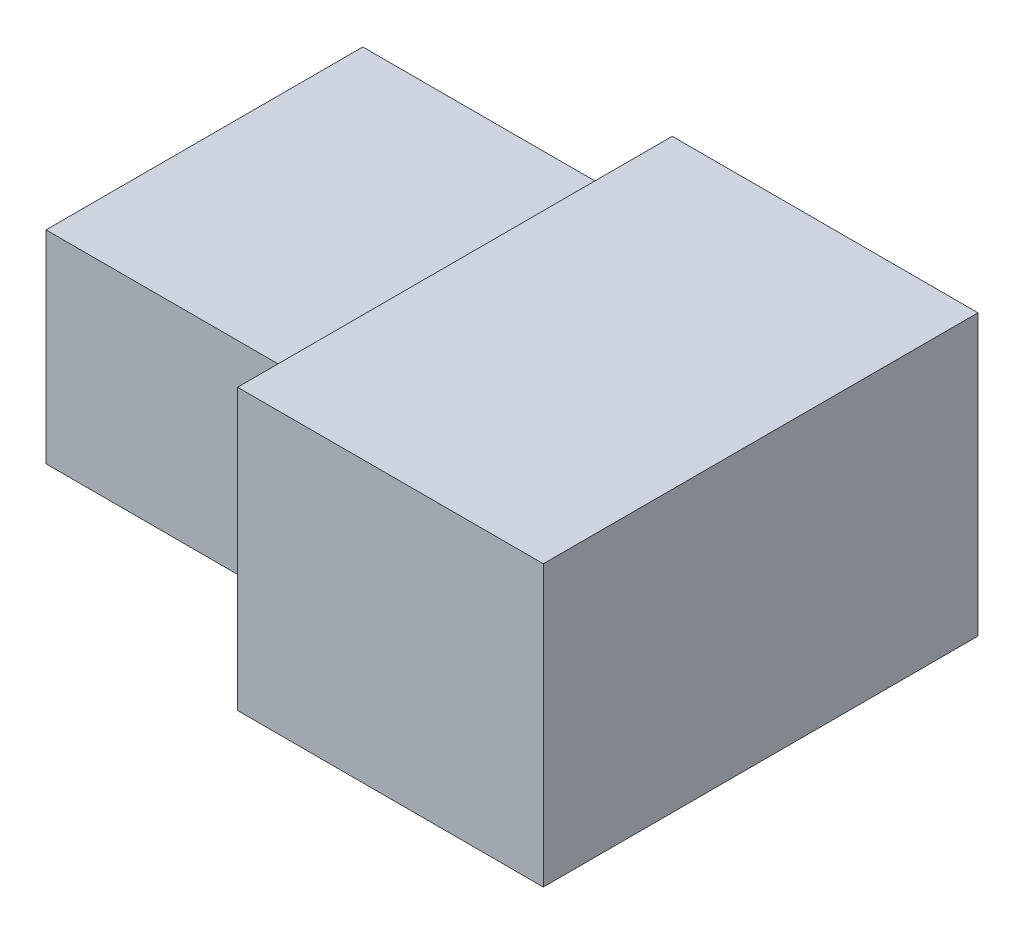
ISO-10303-21;
HEADER;
FILE_DESCRIPTION(('STEP AP214'),'2;1');
FILE_NAME('part.step','',(''),(''),'','','');
FILE_SCHEMA(('AUTOMOTIVE_DESIGN { 1 0 10303 214 1 1 1 1 }'));
ENDSEC;
DATA;
#1=APPLICATION_CONTEXT('core data for automotive mechanical design processes');
#2=APPLICATION_PROTOCOL_DEFINITION('international standard','automotive_design',2000,#1);
#3=PRODUCT_CONTEXT('',#1,'mechanical');
#4=PRODUCT('Part','Part','',(#3));
#5=PRODUCT_RELATED_PRODUCT_CATEGORY('part','',(#4));
#6=PRODUCT_DEFINITION_FORMATION('','',#4);
#7=PRODUCT_DEFINITION_CONTEXT('part definition',#1,'design');
#8=PRODUCT_DEFINITION('design','',#6,#7);
#9=PRODUCT_DEFINITION_SHAPE('','',#8);
#10=(LENGTH_UNIT() NAMED_UNIT(*) SI_UNIT(.MILLI.,.METRE.));
#11=(NAMED_UNIT(*) PLANE_ANGLE_UNIT() SI_UNIT($,.RADIAN.));
#12=(NAMED_UNIT(*) SI_UNIT($,.STERADIAN.) SOLID_ANGLE_UNIT());
#13=UNCERTAINTY_MEASURE_WITH_UNIT(LENGTH_MEASURE(1.E-05),#10,'distance_accuracy_value','');
#14=(GEOMETRIC_REPRESENTATION_CONTEXT(3) GLOBAL_UNCERTAINTY_ASSIGNED_CONTEXT((#13)) GLOBAL_UNIT_ASSIGNED_CONTEXT((#10,
#11,#12)) REPRESENTATION_CONTEXT('',''));
#15=CARTESIAN_POINT('',(0.,0.,0.));
#16=DIRECTION('',(0.,0.,1.));
#17=DIRECTION('',(1.,0.,0.));
#18=AXIS2_PLACEMENT_3D('',#15,#16,#17);
#19=CARTESIAN_POINT('',(83.,76.,0.));
#20=DIRECTION('',(1.,0.,0.));
#21=DIRECTION('',(0.,0.,-1.));
#22=AXIS2_PLACEMENT_3D('',#19,#20,#21);
#23=PLANE('',#22);
#24=DIRECTION('',(0.,0.,1.));
#25=VECTOR('',#24,1.);
#26=CARTESIAN_POINT('',(83.,0.,0.));
#27=LINE('',#26,#25);
#28=CARTESIAN_POINT('',(83.,0.,0.));
#29=VERTEX_POINT('',#28);
#30=CARTESIAN_POINT('',(83.,0.,118.));
#31=VERTEX_POINT('',#30);
#32=EDGE_CURVE('E130',#29,#31,#27,.T.);
#33=ORIENTED_EDGE('',*,*,#32,.F.);
#34=DIRECTION('',(0.,-1.,0.));
#35=VECTOR('',#34,1.);
#36=CARTESIAN_POINT('',(83.,76.,0.));
#37=LINE('',#36,#35);
#38=CARTESIAN_POINT('',(83.,76.,0.));
#39=VERTEX_POINT('',#38);
#40=EDGE_CURVE('E11',#39,#29,#37,.T.);
#41=ORIENTED_EDGE('',*,*,#40,.F.);
#42=DIRECTION('',(0.,0.,1.));
#43=VECTOR('',#42,1.);
#44=CARTESIAN_POINT('',(83.,76.,0.));
#45=LINE('',#44,#43);
#46=CARTESIAN_POINT('',(83.,76.,118.));
#47=VERTEX_POINT('',#46);
#48=EDGE_CURVE('E140',#39,#47,#45,.T.);
#49=ORIENTED_EDGE('',*,*,#48,.T.);
#50=DIRECTION('',(0.,-1.,0.));
#51=VECTOR('',#50,1.);
#52=CARTESIAN_POINT('',(83.,76.,118.));
#53=LINE('',#52,#51);
#54=EDGE_CURVE('E80',#47,#31,#53,.T.);
#55=ORIENTED_EDGE('',*,*,#54,.T.);
#56=EDGE_LOOP('',(#33,#41,#49,#55));
#57=FACE_BOUND('',#56,.T.);
#58=ADVANCED_FACE('F39',(#57),#23,.T.);
#59=CARTESIAN_POINT('',(0.,76.,0.));
#60=DIRECTION('',(0.,0.,-1.));
#61=DIRECTION('',(-1.,0.,0.));
#62=AXIS2_PLACEMENT_3D('',#59,#60,#61);
#63=PLANE('',#62);
#64=DIRECTION('',(1.,0.,0.));
#65=VECTOR('',#64,1.);
#66=CARTESIAN_POINT('',(0.,0.,0.));
#67=LINE('',#66,#65);
#68=CARTESIAN_POINT('',(-84.,0.,0.));
#69=VERTEX_POINT('',#68);
#70=EDGE_CURVE('E127',#69,#29,#67,.T.);
#71=ORIENTED_EDGE('',*,*,#70,.F.);
#72=DIRECTION('',(0.,-1.,0.));
#73=VECTOR('',#72,1.);
#74=CARTESIAN_POINT('',(-84.,55.,0.));
#75=LINE('',#74,#73);
#76=CARTESIAN_POINT('',(-84.,55.,0.));
#77=VERTEX_POINT('',#76);
#78=EDGE_CURVE('E108',#77,#69,#75,.T.);
#79=ORIENTED_EDGE('',*,*,#78,.F.);
#80=DIRECTION('',(-1.,0.,0.));
#81=VECTOR('',#80,1.);
#82=CARTESIAN_POINT('',(0.,55.,0.));
#83=LINE('',#82,#81);
#84=CARTESIAN_POINT('',(0.,55.,0.));
#85=VERTEX_POINT('',#84);
#86=EDGE_CURVE('E115',#85,#77,#83,.T.);
#87=ORIENTED_EDGE('',*,*,#86,.F.);
#88=DIRECTION('',(0.,-1.,0.));
#89=VECTOR('',#88,1.);
#90=CARTESIAN_POINT('',(0.,76.,0.));
#91=LINE('',#90,#89);
#92=CARTESIAN_POINT('',(0.,76.,0.));
#93=VERTEX_POINT('',#92);
#94=EDGE_CURVE('E47',#93,#85,#91,.T.);
#95=ORIENTED_EDGE('',*,*,#94,.F.);
#96=DIRECTION('',(1.,0.,0.));
#97=VECTOR('',#96,1.);
#98=CARTESIAN_POINT('',(0.,76.,0.));
#99=LINE('',#98,#97);
#100=EDGE_CURVE('E143',#93,#39,#99,.T.);
#101=ORIENTED_EDGE('',*,*,#100,.T.);
#102=ORIENTED_EDGE('',*,*,#40,.T.);
#103=EDGE_LOOP('',(#71,#79,#87,#95,#101,#102));
#104=FACE_BOUND('',#103,.T.);
#105=ADVANCED_FACE('F125',(#104),#63,.T.);
#106=CARTESIAN_POINT('',(0.,76.,0.));
#107=DIRECTION('',(1.,0.,0.));
#108=DIRECTION('',(0.,0.,-1.));
#109=AXIS2_PLACEMENT_3D('',#106,#107,#108);
#110=PLANE('',#109);
#111=ORIENTED_EDGE('',*,*,#94,.T.);
#112=DIRECTION('',(0.,0.,1.));
#113=VECTOR('',#112,1.);
#114=CARTESIAN_POINT('',(0.,55.,0.));
#115=LINE('',#114,#113);
#116=CARTESIAN_POINT('',(0.,55.,86.));
#117=VERTEX_POINT('',#116);
#118=EDGE_CURVE('E120',#85,#117,#115,.T.);
#119=ORIENTED_EDGE('',*,*,#118,.T.);
#120=DIRECTION('',(0.,-1.,0.));
#121=VECTOR('',#120,1.);
#122=CARTESIAN_POINT('',(0.,55.,86.));
#123=LINE('',#122,#121);
#124=CARTESIAN_POINT('',(0.,0.,86.));
#125=VERTEX_POINT('',#124);
#126=EDGE_CURVE('E136',#117,#125,#123,.T.);
#127=ORIENTED_EDGE('',*,*,#126,.T.);
#128=DIRECTION('',(0.,0.,1.));
#129=VECTOR('',#128,1.);
#130=CARTESIAN_POINT('',(0.,0.,0.));
#131=LINE('',#130,#129);
#132=CARTESIAN_POINT('',(0.,0.,118.));
#133=VERTEX_POINT('',#132);
#134=EDGE_CURVE('E155',#125,#133,#131,.T.);
#135=ORIENTED_EDGE('',*,*,#134,.T.);
#136=DIRECTION('',(0.,-1.,0.));
#137=VECTOR('',#136,1.);
#138=CARTESIAN_POINT('',(0.,76.,118.));
#139=LINE('',#138,#137);
#140=CARTESIAN_POINT('',(0.,76.,118.));
#141=VERTEX_POINT('',#140);
#142=EDGE_CURVE('E162',#141,#133,#139,.T.);
#143=ORIENTED_EDGE('',*,*,#142,.F.);
#144=DIRECTION('',(0.,0.,1.));
#145=VECTOR('',#144,1.);
#146=CARTESIAN_POINT('',(0.,76.,0.));
#147=LINE('',#146,#145);
#148=EDGE_CURVE('E148',#93,#141,#147,.T.);
#149=ORIENTED_EDGE('',*,*,#148,.F.);
#150=EDGE_LOOP('',(#111,#119,#127,#135,#143,#149));
#151=FACE_BOUND('',#150,.T.);
#152=ADVANCED_FACE('F168',(#151),#110,.F.);
#153=CARTESIAN_POINT('',(0.,76.,118.));
#154=DIRECTION('',(0.,0.,-1.));
#155=DIRECTION('',(-1.,0.,0.));
#156=AXIS2_PLACEMENT_3D('',#153,#154,#155);
#157=PLANE('',#156);
#158=DIRECTION('',(1.,0.,0.));
#159=VECTOR('',#158,1.);
#160=CARTESIAN_POINT('',(0.,0.,118.));
#161=LINE('',#160,#159);
#162=EDGE_CURVE('E144',#133,#31,#161,.T.);
#163=ORIENTED_EDGE('',*,*,#162,.T.);
#164=ORIENTED_EDGE('',*,*,#54,.F.);
#165=DIRECTION('',(1.,0.,0.));
#166=VECTOR('',#165,1.);
#167=CARTESIAN_POINT('',(0.,76.,118.));
#168=LINE('',#167,#166);
#169=EDGE_CURVE('E63',#141,#47,#168,.T.);
#170=ORIENTED_EDGE('',*,*,#169,.F.);
#171=ORIENTED_EDGE('',*,*,#142,.T.);
#172=EDGE_LOOP('',(#163,#164,#170,#171));
#173=FACE_BOUND('',#172,.T.);
#174=ADVANCED_FACE('F179',(#173),#157,.F.);
#175=CARTESIAN_POINT('',(0.,76.,0.));
#176=DIRECTION('',(0.,1.,0.));
#177=DIRECTION('',(0.,0.,1.));
#178=AXIS2_PLACEMENT_3D('',#175,#176,#177);
#179=PLANE('',#178);
#180=ORIENTED_EDGE('',*,*,#48,.F.);
#181=ORIENTED_EDGE('',*,*,#100,.F.);
#182=ORIENTED_EDGE('',*,*,#148,.T.);
#183=ORIENTED_EDGE('',*,*,#169,.T.);
#184=EDGE_LOOP('',(#180,#181,#182,#183));
#185=FACE_BOUND('',#184,.T.);
#186=ADVANCED_FACE('F171',(#185),#179,.T.);
#187=CARTESIAN_POINT('',(0.,0.,0.));
#188=DIRECTION('',(0.,1.,0.));
#189=DIRECTION('',(0.,0.,1.));
#190=AXIS2_PLACEMENT_3D('',#187,#188,#189);
#191=PLANE('',#190);
#192=ORIENTED_EDGE('',*,*,#32,.T.);
#193=ORIENTED_EDGE('',*,*,#162,.F.);
#194=ORIENTED_EDGE('',*,*,#134,.F.);
#195=DIRECTION('',(-1.,0.,0.));
#196=VECTOR('',#195,1.);
#197=CARTESIAN_POINT('',(0.,0.,86.));
#198=LINE('',#197,#196);
#199=CARTESIAN_POINT('',(-84.,0.,86.));
#200=VERTEX_POINT('',#199);
#201=EDGE_CURVE('E54',#125,#200,#198,.T.);
#202=ORIENTED_EDGE('',*,*,#201,.T.);
#203=DIRECTION('',(0.,0.,1.));
#204=VECTOR('',#203,1.);
#205=CARTESIAN_POINT('',(-84.,0.,0.));
#206=LINE('',#205,#204);
#207=EDGE_CURVE('E258',#69,#200,#206,.T.);
#208=ORIENTED_EDGE('',*,*,#207,.F.);
#209=ORIENTED_EDGE('',*,*,#70,.T.);
#210=EDGE_LOOP('',(#192,#193,#194,#202,#208,#209));
#211=FACE_BOUND('',#210,.T.);
#212=ADVANCED_FACE('F185',(#211),#191,.F.);
#213=CARTESIAN_POINT('',(-84.,55.,0.));
#214=DIRECTION('',(1.,0.,0.));
#215=DIRECTION('',(0.,0.,-1.));
#216=AXIS2_PLACEMENT_3D('',#213,#214,#215);
#217=PLANE('',#216);
#218=ORIENTED_EDGE('',*,*,#207,.T.);
#219=DIRECTION('',(0.,-1.,0.));
#220=VECTOR('',#219,1.);
#221=CARTESIAN_POINT('',(-84.,55.,86.));
#222=LINE('',#221,#220);
#223=CARTESIAN_POINT('',(-84.,55.,86.));
#224=VERTEX_POINT('',#223);
#225=EDGE_CURVE('E109',#224,#200,#222,.T.);
#226=ORIENTED_EDGE('',*,*,#225,.F.);
#227=DIRECTION('',(0.,0.,1.));
#228=VECTOR('',#227,1.);
#229=CARTESIAN_POINT('',(-84.,55.,0.));
#230=LINE('',#229,#228);
#231=EDGE_CURVE('E103',#77,#224,#230,.T.);
#232=ORIENTED_EDGE('',*,*,#231,.F.);
#233=ORIENTED_EDGE('',*,*,#78,.T.);
#234=EDGE_LOOP('',(#218,#226,#232,#233));
#235=FACE_BOUND('',#234,.T.);
#236=ADVANCED_FACE('F106',(#235),#217,.F.);
#237=CARTESIAN_POINT('',(0.,55.,86.));
#238=DIRECTION('',(0.,0.,1.));
#239=DIRECTION('',(1.,0.,0.));
#240=AXIS2_PLACEMENT_3D('',#237,#238,#239);
#241=PLANE('',#240);
#242=ORIENTED_EDGE('',*,*,#201,.F.);
#243=ORIENTED_EDGE('',*,*,#126,.F.);
#244=DIRECTION('',(-1.,0.,0.));
#245=VECTOR('',#244,1.);
#246=CARTESIAN_POINT('',(0.,55.,86.));
#247=LINE('',#246,#245);
#248=EDGE_CURVE('E114',#117,#224,#247,.T.);
#249=ORIENTED_EDGE('',*,*,#248,.T.);
#250=ORIENTED_EDGE('',*,*,#225,.T.);
#251=EDGE_LOOP('',(#242,#243,#249,#250));
#252=FACE_BOUND('',#251,.T.);
#253=ADVANCED_FACE('F193',(#252),#241,.T.);
#254=CARTESIAN_POINT('',(0.,55.,0.));
#255=DIRECTION('',(0.,1.,0.));
#256=DIRECTION('',(0.,0.,1.));
#257=AXIS2_PLACEMENT_3D('',#254,#255,#256);
#258=PLANE('',#257);
#259=ORIENTED_EDGE('',*,*,#86,.T.);
#260=ORIENTED_EDGE('',*,*,#231,.T.);
#261=ORIENTED_EDGE('',*,*,#248,.F.);
#262=ORIENTED_EDGE('',*,*,#118,.F.);
#263=EDGE_LOOP('',(#259,#260,#261,#262));
#264=FACE_BOUND('',#263,.T.);
#265=ADVANCED_FACE('F118',(#264),#258,.T.);
#266=CLOSED_SHELL('',(#58,#105,#152,#174,#186,#212,#236,#253,#265));
#267=MANIFOLD_SOLID_BREP('B2',#266);
#268=ADVANCED_BREP_SHAPE_REPRESENTATION('',(#18,#267),#14);
#269=SHAPE_DEFINITION_REPRESENTATION(#9,#268);
ENDSEC;
END-ISO-10303-21;
